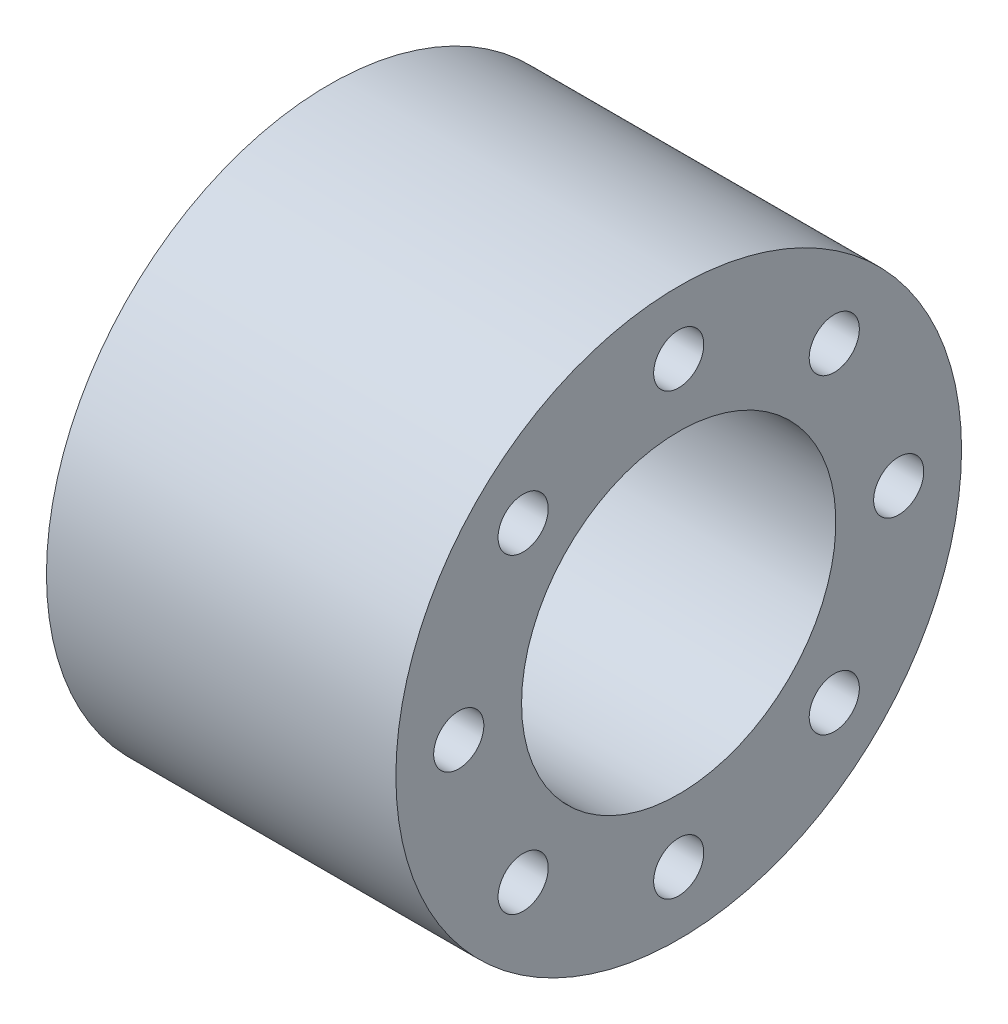
ISO-10303-21;
HEADER;
FILE_DESCRIPTION(('STEP AP214'),'2;1');
FILE_NAME('part.step','',(''),(''),'','','');
FILE_SCHEMA(('AUTOMOTIVE_DESIGN { 1 0 10303 214 1 1 1 1 }'));
ENDSEC;
DATA;
#1=APPLICATION_CONTEXT('core data for automotive mechanical design processes');
#2=APPLICATION_PROTOCOL_DEFINITION('international standard','automotive_design',2000,#1);
#3=PRODUCT_CONTEXT('',#1,'mechanical');
#4=PRODUCT('Part','Part','',(#3));
#5=PRODUCT_RELATED_PRODUCT_CATEGORY('part','',(#4));
#6=PRODUCT_DEFINITION_FORMATION('','',#4);
#7=PRODUCT_DEFINITION_CONTEXT('part definition',#1,'design');
#8=PRODUCT_DEFINITION('design','',#6,#7);
#9=PRODUCT_DEFINITION_SHAPE('','',#8);
#10=(LENGTH_UNIT() NAMED_UNIT(*) SI_UNIT(.MILLI.,.METRE.));
#11=(NAMED_UNIT(*) PLANE_ANGLE_UNIT() SI_UNIT($,.RADIAN.));
#12=(NAMED_UNIT(*) SI_UNIT($,.STERADIAN.) SOLID_ANGLE_UNIT());
#13=UNCERTAINTY_MEASURE_WITH_UNIT(LENGTH_MEASURE(1.E-05),#10,'distance_accuracy_value','');
#14=(GEOMETRIC_REPRESENTATION_CONTEXT(3) GLOBAL_UNCERTAINTY_ASSIGNED_CONTEXT((#13)) GLOBAL_UNIT_ASSIGNED_CONTEXT((#10,
#11,#12)) REPRESENTATION_CONTEXT('',''));
#15=CARTESIAN_POINT('',(0.,0.,0.));
#16=DIRECTION('',(0.,0.,1.));
#17=DIRECTION('',(1.,0.,0.));
#18=AXIS2_PLACEMENT_3D('',#15,#16,#17);
#19=CARTESIAN_POINT('',(0.,38.1,0.));
#20=DIRECTION('',(1.,0.,0.));
#21=DIRECTION('',(0.,0.,-1.));
#22=AXIS2_PLACEMENT_3D('',#19,#20,#21);
#23=PLANE('',#22);
#24=CARTESIAN_POINT('',(0.,27.8665163993717,-11.542689028712));
#25=DIRECTION('',(-1.,0.,0.));
#26=DIRECTION('',(0.,0.,1.));
#27=AXIS2_PLACEMENT_3D('',#24,#25,#26);
#28=CIRCLE('',#27,2.38124999999999);
#29=CARTESIAN_POINT('',(0.,27.8665163993717,-9.16143902871205));
#30=VERTEX_POINT('',#29);
#31=EDGE_CURVE('E84',#30,#30,#28,.T.);
#32=ORIENTED_EDGE('',*,*,#31,.F.);
#33=EDGE_LOOP('',(#32));
#34=FACE_BOUND('',#33,.T.);
#35=CARTESIAN_POINT('',(0.,11.542689028712,27.8665163993717));
#36=DIRECTION('',(-1.,0.,0.));
#37=DIRECTION('',(0.,0.,1.));
#38=AXIS2_PLACEMENT_3D('',#35,#36,#37);
#39=CIRCLE('',#38,2.38124999999999);
#40=CARTESIAN_POINT('',(0.,11.542689028712,30.2477663993717));
#41=VERTEX_POINT('',#40);
#42=EDGE_CURVE('E83',#41,#41,#39,.T.);
#43=ORIENTED_EDGE('',*,*,#42,.F.);
#44=EDGE_LOOP('',(#43));
#45=FACE_BOUND('',#44,.T.);
#46=CARTESIAN_POINT('',(0.,-27.8665163993717,11.542689028712));
#47=DIRECTION('',(-1.,0.,0.));
#48=DIRECTION('',(0.,0.,1.));
#49=AXIS2_PLACEMENT_3D('',#46,#47,#48);
#50=CIRCLE('',#49,2.38124999999999);
#51=CARTESIAN_POINT('',(0.,-27.8665163993717,13.923939028712));
#52=VERTEX_POINT('',#51);
#53=EDGE_CURVE('E97',#52,#52,#50,.T.);
#54=ORIENTED_EDGE('',*,*,#53,.F.);
#55=EDGE_LOOP('',(#54));
#56=FACE_BOUND('',#55,.T.);
#57=CARTESIAN_POINT('',(0.,-11.542689028712,-27.8665163993717));
#58=DIRECTION('',(-1.,0.,0.));
#59=DIRECTION('',(0.,0.,1.));
#60=AXIS2_PLACEMENT_3D('',#57,#58,#59);
#61=CIRCLE('',#60,2.38124999999999);
#62=CARTESIAN_POINT('',(0.,-11.542689028712,-25.4852663993717));
#63=VERTEX_POINT('',#62);
#64=EDGE_CURVE('E105',#63,#63,#61,.T.);
#65=ORIENTED_EDGE('',*,*,#64,.F.);
#66=EDGE_LOOP('',(#65));
#67=FACE_BOUND('',#66,.T.);
#68=CARTESIAN_POINT('',(0.,0.,0.));
#69=DIRECTION('',(-1.,0.,0.));
#70=DIRECTION('',(0.,0.,1.));
#71=AXIS2_PLACEMENT_3D('',#68,#69,#70);
#72=CIRCLE('',#71,21.1666666666667);
#73=CARTESIAN_POINT('',(0.,0.,21.1666666666667));
#74=VERTEX_POINT('',#73);
#75=EDGE_CURVE('E11',#74,#74,#72,.T.);
#76=ORIENTED_EDGE('',*,*,#75,.F.);
#77=EDGE_LOOP('',(#76));
#78=FACE_BOUND('',#77,.T.);
#79=CARTESIAN_POINT('',(0.,0.,0.));
#80=DIRECTION('',(-1.,0.,0.));
#81=DIRECTION('',(0.,0.,1.));
#82=AXIS2_PLACEMENT_3D('',#79,#80,#81);
#83=CIRCLE('',#82,38.1);
#84=CARTESIAN_POINT('',(0.,0.,38.1));
#85=VERTEX_POINT('',#84);
#86=EDGE_CURVE('E241',#85,#85,#83,.T.);
#87=ORIENTED_EDGE('',*,*,#86,.T.);
#88=EDGE_LOOP('',(#87));
#89=FACE_BOUND('',#88,.T.);
#90=CARTESIAN_POINT('',(0.,20.9539309491616,-20.9539309491611));
#91=DIRECTION('',(-1.,0.,0.));
#92=DIRECTION('',(0.,0.,1.));
#93=AXIS2_PLACEMENT_3D('',#90,#91,#92);
#94=CIRCLE('',#93,5.55625);
#95=CARTESIAN_POINT('',(0.,20.9539309491616,-15.3976809491611));
#96=VERTEX_POINT('',#95);
#97=EDGE_CURVE('E225',#96,#96,#94,.T.);
#98=ORIENTED_EDGE('',*,*,#97,.F.);
#99=EDGE_LOOP('',(#98));
#100=FACE_BOUND('',#99,.T.);
#101=CARTESIAN_POINT('',(0.,3.05966363356447E-13,-29.6333333333333));
#102=DIRECTION('',(-1.,0.,0.));
#103=DIRECTION('',(0.,0.,1.));
#104=AXIS2_PLACEMENT_3D('',#101,#102,#103);
#105=CIRCLE('',#104,5.55625);
#106=CARTESIAN_POINT('',(0.,3.05966363356447E-13,-24.0770833333333));
#107=VERTEX_POINT('',#106);
#108=EDGE_CURVE('E209',#107,#107,#105,.T.);
#109=ORIENTED_EDGE('',*,*,#108,.F.);
#110=EDGE_LOOP('',(#109));
#111=FACE_BOUND('',#110,.T.);
#112=CARTESIAN_POINT('',(0.,-20.9539309491612,-20.9539309491615));
#113=DIRECTION('',(-1.,0.,0.));
#114=DIRECTION('',(0.,0.,1.));
#115=AXIS2_PLACEMENT_3D('',#112,#113,#114);
#116=CIRCLE('',#115,5.55625);
#117=CARTESIAN_POINT('',(0.,-20.9539309491612,-15.3976809491615));
#118=VERTEX_POINT('',#117);
#119=EDGE_CURVE('E193',#118,#118,#116,.T.);
#120=ORIENTED_EDGE('',*,*,#119,.F.);
#121=EDGE_LOOP('',(#120));
#122=FACE_BOUND('',#121,.T.);
#123=CARTESIAN_POINT('',(0.,-29.6333333333333,-2.09901540593194E-13));
#124=DIRECTION('',(-1.,0.,0.));
#125=DIRECTION('',(0.,0.,1.));
#126=AXIS2_PLACEMENT_3D('',#123,#124,#125);
#127=CIRCLE('',#126,5.55625);
#128=CARTESIAN_POINT('',(0.,-29.6333333333333,5.55624999999979));
#129=VERTEX_POINT('',#128);
#130=EDGE_CURVE('E177',#129,#129,#127,.T.);
#131=ORIENTED_EDGE('',*,*,#130,.F.);
#132=EDGE_LOOP('',(#131));
#133=FACE_BOUND('',#132,.T.);
#134=CARTESIAN_POINT('',(0.,-20.9539309491618,20.953930949161));
#135=DIRECTION('',(-1.,0.,0.));
#136=DIRECTION('',(0.,0.,1.));
#137=AXIS2_PLACEMENT_3D('',#134,#135,#136);
#138=CIRCLE('',#137,5.55625);
#139=CARTESIAN_POINT('',(0.,-20.9539309491618,26.510180949161));
#140=VERTEX_POINT('',#139);
#141=EDGE_CURVE('E161',#140,#140,#138,.T.);
#142=ORIENTED_EDGE('',*,*,#141,.F.);
#143=EDGE_LOOP('',(#142));
#144=FACE_BOUND('',#143,.T.);
#145=CARTESIAN_POINT('',(0.,-5.27355936696949E-13,29.6333333333333));
#146=DIRECTION('',(-1.,0.,0.));
#147=DIRECTION('',(0.,0.,1.));
#148=AXIS2_PLACEMENT_3D('',#145,#146,#147);
#149=CIRCLE('',#148,5.55625);
#150=CARTESIAN_POINT('',(0.,-5.27355936696949E-13,35.1895833333333));
#151=VERTEX_POINT('',#150);
#152=EDGE_CURVE('E145',#151,#151,#149,.T.);
#153=ORIENTED_EDGE('',*,*,#152,.F.);
#154=EDGE_LOOP('',(#153));
#155=FACE_BOUND('',#154,.T.);
#156=CARTESIAN_POINT('',(0.,20.953930949161,20.9539309491617));
#157=DIRECTION('',(-1.,0.,0.));
#158=DIRECTION('',(0.,0.,1.));
#159=AXIS2_PLACEMENT_3D('',#156,#157,#158);
#160=CIRCLE('',#159,5.55625);
#161=CARTESIAN_POINT('',(0.,20.953930949161,26.5101809491617));
#162=VERTEX_POINT('',#161);
#163=EDGE_CURVE('E129',#162,#162,#160,.T.);
#164=ORIENTED_EDGE('',*,*,#163,.F.);
#165=EDGE_LOOP('',(#164));
#166=FACE_BOUND('',#165,.T.);
#167=CARTESIAN_POINT('',(0.,29.6333333333333,0.));
#168=DIRECTION('',(-1.,0.,0.));
#169=DIRECTION('',(0.,0.,1.));
#170=AXIS2_PLACEMENT_3D('',#167,#168,#169);
#171=CIRCLE('',#170,5.55625);
#172=CARTESIAN_POINT('',(0.,29.6333333333333,5.55625));
#173=VERTEX_POINT('',#172);
#174=EDGE_CURVE('E113',#173,#173,#171,.T.);
#175=ORIENTED_EDGE('',*,*,#174,.F.);
#176=EDGE_LOOP('',(#175));
#177=FACE_BOUND('',#176,.T.);
#178=ADVANCED_FACE('F51',(#34,#45,#56,#67,#78,#89,#100,#111,#122,#133,#144,#155,#166,#177),#23,.F.);
#179=CARTESIAN_POINT('',(0.,0.,0.));
#180=DIRECTION('',(-1.,0.,0.));
#181=DIRECTION('',(0.,0.,1.));
#182=AXIS2_PLACEMENT_3D('',#179,#180,#181);
#183=CYLINDRICAL_SURFACE('',#182,21.1666666666667);
#184=CARTESIAN_POINT('',(47.06874,0.,0.));
#185=DIRECTION('',(-1.,0.,0.));
#186=DIRECTION('',(0.,0.,1.));
#187=AXIS2_PLACEMENT_3D('',#184,#185,#186);
#188=CIRCLE('',#187,21.1666666666667);
#189=CARTESIAN_POINT('',(47.06874,0.,21.1666666666667));
#190=VERTEX_POINT('',#189);
#191=EDGE_CURVE('E59',#190,#190,#188,.T.);
#192=ORIENTED_EDGE('',*,*,#191,.F.);
#193=EDGE_LOOP('',(#192));
#194=FACE_BOUND('',#193,.T.);
#195=ORIENTED_EDGE('',*,*,#75,.T.);
#196=EDGE_LOOP('',(#195));
#197=FACE_BOUND('',#196,.T.);
#198=ADVANCED_FACE('F254',(#194,#197),#183,.F.);
#199=CARTESIAN_POINT('',(47.06874,38.1,0.));
#200=DIRECTION('',(-1.,0.,0.));
#201=DIRECTION('',(0.,0.,1.));
#202=AXIS2_PLACEMENT_3D('',#199,#200,#201);
#203=PLANE('',#202);
#204=CARTESIAN_POINT('',(47.06874,29.6333333333333,0.));
#205=DIRECTION('',(-1.,0.,0.));
#206=DIRECTION('',(0.,0.,1.));
#207=AXIS2_PLACEMENT_3D('',#204,#205,#206);
#208=CIRCLE('',#207,3.37819999999999);
#209=CARTESIAN_POINT('',(47.06874,29.6333333333333,3.37819999999999));
#210=VERTEX_POINT('',#209);
#211=EDGE_CURVE('E125',#210,#210,#208,.T.);
#212=ORIENTED_EDGE('',*,*,#211,.T.);
#213=EDGE_LOOP('',(#212));
#214=FACE_BOUND('',#213,.T.);
#215=CARTESIAN_POINT('',(47.06874,20.953930949161,20.9539309491617));
#216=DIRECTION('',(-1.,0.,0.));
#217=DIRECTION('',(0.,0.,1.));
#218=AXIS2_PLACEMENT_3D('',#215,#216,#217);
#219=CIRCLE('',#218,3.3782);
#220=CARTESIAN_POINT('',(47.06874,20.953930949161,24.3321309491617));
#221=VERTEX_POINT('',#220);
#222=EDGE_CURVE('E141',#221,#221,#219,.T.);
#223=ORIENTED_EDGE('',*,*,#222,.T.);
#224=EDGE_LOOP('',(#223));
#225=FACE_BOUND('',#224,.T.);
#226=CARTESIAN_POINT('',(47.06874,-5.27355936696949E-13,29.6333333333333));
#227=DIRECTION('',(-1.,0.,0.));
#228=DIRECTION('',(0.,0.,1.));
#229=AXIS2_PLACEMENT_3D('',#226,#227,#228);
#230=CIRCLE('',#229,3.3782);
#231=CARTESIAN_POINT('',(47.06874,-5.27355936696949E-13,33.0115333333333));
#232=VERTEX_POINT('',#231);
#233=EDGE_CURVE('E157',#232,#232,#230,.T.);
#234=ORIENTED_EDGE('',*,*,#233,.T.);
#235=EDGE_LOOP('',(#234));
#236=FACE_BOUND('',#235,.T.);
#237=CARTESIAN_POINT('',(47.06874,-20.9539309491618,20.953930949161));
#238=DIRECTION('',(-1.,0.,0.));
#239=DIRECTION('',(0.,0.,1.));
#240=AXIS2_PLACEMENT_3D('',#237,#238,#239);
#241=CIRCLE('',#240,3.3782);
#242=CARTESIAN_POINT('',(47.06874,-20.9539309491618,24.332130949161));
#243=VERTEX_POINT('',#242);
#244=EDGE_CURVE('E173',#243,#243,#241,.T.);
#245=ORIENTED_EDGE('',*,*,#244,.T.);
#246=EDGE_LOOP('',(#245));
#247=FACE_BOUND('',#246,.T.);
#248=CARTESIAN_POINT('',(47.06874,-29.6333333333333,-2.09901540593194E-13));
#249=DIRECTION('',(-1.,0.,0.));
#250=DIRECTION('',(0.,0.,1.));
#251=AXIS2_PLACEMENT_3D('',#248,#249,#250);
#252=CIRCLE('',#251,3.3782);
#253=CARTESIAN_POINT('',(47.06874,-29.6333333333333,3.37819999999979));
#254=VERTEX_POINT('',#253);
#255=EDGE_CURVE('E189',#254,#254,#252,.T.);
#256=ORIENTED_EDGE('',*,*,#255,.T.);
#257=EDGE_LOOP('',(#256));
#258=FACE_BOUND('',#257,.T.);
#259=CARTESIAN_POINT('',(47.06874,-20.9539309491612,-20.9539309491615));
#260=DIRECTION('',(-1.,0.,0.));
#261=DIRECTION('',(0.,0.,1.));
#262=AXIS2_PLACEMENT_3D('',#259,#260,#261);
#263=CIRCLE('',#262,3.3782);
#264=CARTESIAN_POINT('',(47.06874,-20.9539309491612,-17.5757309491615));
#265=VERTEX_POINT('',#264);
#266=EDGE_CURVE('E205',#265,#265,#263,.T.);
#267=ORIENTED_EDGE('',*,*,#266,.T.);
#268=EDGE_LOOP('',(#267));
#269=FACE_BOUND('',#268,.T.);
#270=CARTESIAN_POINT('',(47.06874,3.05966363356447E-13,-29.6333333333333));
#271=DIRECTION('',(-1.,0.,0.));
#272=DIRECTION('',(0.,0.,1.));
#273=AXIS2_PLACEMENT_3D('',#270,#271,#272);
#274=CIRCLE('',#273,3.3782);
#275=CARTESIAN_POINT('',(47.06874,3.05966363356447E-13,-26.2551333333333));
#276=VERTEX_POINT('',#275);
#277=EDGE_CURVE('E221',#276,#276,#274,.T.);
#278=ORIENTED_EDGE('',*,*,#277,.T.);
#279=EDGE_LOOP('',(#278));
#280=FACE_BOUND('',#279,.T.);
#281=CARTESIAN_POINT('',(47.06874,20.9539309491616,-20.9539309491611));
#282=DIRECTION('',(-1.,0.,0.));
#283=DIRECTION('',(0.,0.,1.));
#284=AXIS2_PLACEMENT_3D('',#281,#282,#283);
#285=CIRCLE('',#284,3.3782);
#286=CARTESIAN_POINT('',(47.06874,20.9539309491616,-17.5757309491611));
#287=VERTEX_POINT('',#286);
#288=EDGE_CURVE('E237',#287,#287,#285,.T.);
#289=ORIENTED_EDGE('',*,*,#288,.T.);
#290=EDGE_LOOP('',(#289));
#291=FACE_BOUND('',#290,.T.);
#292=CARTESIAN_POINT('',(47.06874,0.,0.));
#293=DIRECTION('',(-1.,0.,0.));
#294=DIRECTION('',(0.,0.,1.));
#295=AXIS2_PLACEMENT_3D('',#292,#293,#294);
#296=CIRCLE('',#295,38.1);
#297=CARTESIAN_POINT('',(47.06874,0.,38.1));
#298=VERTEX_POINT('',#297);
#299=EDGE_CURVE('E245',#298,#298,#296,.T.);
#300=ORIENTED_EDGE('',*,*,#299,.F.);
#301=EDGE_LOOP('',(#300));
#302=FACE_BOUND('',#301,.T.);
#303=ORIENTED_EDGE('',*,*,#191,.T.);
#304=EDGE_LOOP('',(#303));
#305=FACE_BOUND('',#304,.T.);
#306=ADVANCED_FACE('F252',(#214,#225,#236,#247,#258,#269,#280,#291,#302,#305),#203,.F.);
#307=CARTESIAN_POINT('',(0.,0.,0.));
#308=DIRECTION('',(-1.,0.,0.));
#309=DIRECTION('',(0.,0.,1.));
#310=AXIS2_PLACEMENT_3D('',#307,#308,#309);
#311=CYLINDRICAL_SURFACE('',#310,38.1);
#312=ORIENTED_EDGE('',*,*,#86,.F.);
#313=EDGE_LOOP('',(#312));
#314=FACE_BOUND('',#313,.T.);
#315=ORIENTED_EDGE('',*,*,#299,.T.);
#316=EDGE_LOOP('',(#315));
#317=FACE_BOUND('',#316,.T.);
#318=ADVANCED_FACE('F384',(#314,#317),#311,.T.);
#319=CARTESIAN_POINT('',(0.,20.9539309491616,-20.9539309491611));
#320=DIRECTION('',(-1.,0.,0.));
#321=DIRECTION('',(0.,0.,1.));
#322=AXIS2_PLACEMENT_3D('',#319,#320,#321);
#323=CYLINDRICAL_SURFACE('',#322,3.3782);
#324=ORIENTED_EDGE('',*,*,#288,.F.);
#325=EDGE_LOOP('',(#324));
#326=FACE_BOUND('',#325,.T.);
#327=CARTESIAN_POINT('',(6.35,20.9539309491616,-20.9539309491611));
#328=DIRECTION('',(-1.,0.,0.));
#329=DIRECTION('',(0.,0.,1.));
#330=AXIS2_PLACEMENT_3D('',#327,#328,#329);
#331=CIRCLE('',#330,3.3782);
#332=CARTESIAN_POINT('',(6.35,20.9539309491616,-17.5757309491611));
#333=VERTEX_POINT('',#332);
#334=EDGE_CURVE('E233',#333,#333,#331,.T.);
#335=ORIENTED_EDGE('',*,*,#334,.T.);
#336=EDGE_LOOP('',(#335));
#337=FACE_BOUND('',#336,.T.);
#338=ADVANCED_FACE('F380',(#326,#337),#323,.F.);
#339=CARTESIAN_POINT('',(6.35,24.3321309491616,-20.9539309491611));
#340=DIRECTION('',(1.,0.,0.));
#341=DIRECTION('',(0.,0.,-1.));
#342=AXIS2_PLACEMENT_3D('',#339,#340,#341);
#343=PLANE('',#342);
#344=ORIENTED_EDGE('',*,*,#334,.F.);
#345=EDGE_LOOP('',(#344));
#346=FACE_BOUND('',#345,.T.);
#347=CARTESIAN_POINT('',(6.35,20.9539309491616,-20.9539309491611));
#348=DIRECTION('',(-1.,0.,0.));
#349=DIRECTION('',(0.,0.,1.));
#350=AXIS2_PLACEMENT_3D('',#347,#348,#349);
#351=CIRCLE('',#350,5.55625);
#352=CARTESIAN_POINT('',(6.35,20.9539309491616,-15.3976809491611));
#353=VERTEX_POINT('',#352);
#354=EDGE_CURVE('E229',#353,#353,#351,.T.);
#355=ORIENTED_EDGE('',*,*,#354,.T.);
#356=EDGE_LOOP('',(#355));
#357=FACE_BOUND('',#356,.T.);
#358=ADVANCED_FACE('F376',(#346,#357),#343,.F.);
#359=CARTESIAN_POINT('',(0.,20.9539309491616,-20.9539309491611));
#360=DIRECTION('',(-1.,0.,0.));
#361=DIRECTION('',(0.,0.,1.));
#362=AXIS2_PLACEMENT_3D('',#359,#360,#361);
#363=CYLINDRICAL_SURFACE('',#362,5.55625);
#364=ORIENTED_EDGE('',*,*,#354,.F.);
#365=EDGE_LOOP('',(#364));
#366=FACE_BOUND('',#365,.T.);
#367=ORIENTED_EDGE('',*,*,#97,.T.);
#368=EDGE_LOOP('',(#367));
#369=FACE_BOUND('',#368,.T.);
#370=ADVANCED_FACE('F372',(#366,#369),#363,.F.);
#371=CARTESIAN_POINT('',(0.,3.05966363356447E-13,-29.6333333333333));
#372=DIRECTION('',(-1.,0.,0.));
#373=DIRECTION('',(0.,0.,1.));
#374=AXIS2_PLACEMENT_3D('',#371,#372,#373);
#375=CYLINDRICAL_SURFACE('',#374,3.3782);
#376=ORIENTED_EDGE('',*,*,#277,.F.);
#377=EDGE_LOOP('',(#376));
#378=FACE_BOUND('',#377,.T.);
#379=CARTESIAN_POINT('',(6.35,3.05966363356447E-13,-29.6333333333333));
#380=DIRECTION('',(-1.,0.,0.));
#381=DIRECTION('',(0.,0.,1.));
#382=AXIS2_PLACEMENT_3D('',#379,#380,#381);
#383=CIRCLE('',#382,3.3782);
#384=CARTESIAN_POINT('',(6.35,3.05966363356447E-13,-26.2551333333333));
#385=VERTEX_POINT('',#384);
#386=EDGE_CURVE('E217',#385,#385,#383,.T.);
#387=ORIENTED_EDGE('',*,*,#386,.T.);
#388=EDGE_LOOP('',(#387));
#389=FACE_BOUND('',#388,.T.);
#390=ADVANCED_FACE('F368',(#378,#389),#375,.F.);
#391=CARTESIAN_POINT('',(6.35,3.37820000000031,-29.6333333333333));
#392=DIRECTION('',(1.,0.,0.));
#393=DIRECTION('',(0.,0.,-1.));
#394=AXIS2_PLACEMENT_3D('',#391,#392,#393);
#395=PLANE('',#394);
#396=ORIENTED_EDGE('',*,*,#386,.F.);
#397=EDGE_LOOP('',(#396));
#398=FACE_BOUND('',#397,.T.);
#399=CARTESIAN_POINT('',(6.35,3.05966363356447E-13,-29.6333333333333));
#400=DIRECTION('',(-1.,0.,0.));
#401=DIRECTION('',(0.,0.,1.));
#402=AXIS2_PLACEMENT_3D('',#399,#400,#401);
#403=CIRCLE('',#402,5.55625);
#404=CARTESIAN_POINT('',(6.35,3.05966363356447E-13,-24.0770833333333));
#405=VERTEX_POINT('',#404);
#406=EDGE_CURVE('E213',#405,#405,#403,.T.);
#407=ORIENTED_EDGE('',*,*,#406,.T.);
#408=EDGE_LOOP('',(#407));
#409=FACE_BOUND('',#408,.T.);
#410=ADVANCED_FACE('F364',(#398,#409),#395,.F.);
#411=CARTESIAN_POINT('',(0.,3.05966363356447E-13,-29.6333333333333));
#412=DIRECTION('',(-1.,0.,0.));
#413=DIRECTION('',(0.,0.,1.));
#414=AXIS2_PLACEMENT_3D('',#411,#412,#413);
#415=CYLINDRICAL_SURFACE('',#414,5.55625);
#416=ORIENTED_EDGE('',*,*,#406,.F.);
#417=EDGE_LOOP('',(#416));
#418=FACE_BOUND('',#417,.T.);
#419=ORIENTED_EDGE('',*,*,#108,.T.);
#420=EDGE_LOOP('',(#419));
#421=FACE_BOUND('',#420,.T.);
#422=ADVANCED_FACE('F360',(#418,#421),#415,.F.);
#423=CARTESIAN_POINT('',(0.,-20.9539309491612,-20.9539309491615));
#424=DIRECTION('',(-1.,0.,0.));
#425=DIRECTION('',(0.,0.,1.));
#426=AXIS2_PLACEMENT_3D('',#423,#424,#425);
#427=CYLINDRICAL_SURFACE('',#426,3.3782);
#428=ORIENTED_EDGE('',*,*,#266,.F.);
#429=EDGE_LOOP('',(#428));
#430=FACE_BOUND('',#429,.T.);
#431=CARTESIAN_POINT('',(6.35,-20.9539309491612,-20.9539309491615));
#432=DIRECTION('',(-1.,0.,0.));
#433=DIRECTION('',(0.,0.,1.));
#434=AXIS2_PLACEMENT_3D('',#431,#432,#433);
#435=CIRCLE('',#434,3.3782);
#436=CARTESIAN_POINT('',(6.35,-20.9539309491612,-17.5757309491615));
#437=VERTEX_POINT('',#436);
#438=EDGE_CURVE('E201',#437,#437,#435,.T.);
#439=ORIENTED_EDGE('',*,*,#438,.T.);
#440=EDGE_LOOP('',(#439));
#441=FACE_BOUND('',#440,.T.);
#442=ADVANCED_FACE('F356',(#430,#441),#427,.F.);
#443=CARTESIAN_POINT('',(6.35,-17.5757309491612,-20.9539309491615));
#444=DIRECTION('',(1.,0.,0.));
#445=DIRECTION('',(0.,0.,-1.));
#446=AXIS2_PLACEMENT_3D('',#443,#444,#445);
#447=PLANE('',#446);
#448=ORIENTED_EDGE('',*,*,#438,.F.);
#449=EDGE_LOOP('',(#448));
#450=FACE_BOUND('',#449,.T.);
#451=CARTESIAN_POINT('',(6.35,-20.9539309491612,-20.9539309491615));
#452=DIRECTION('',(-1.,0.,0.));
#453=DIRECTION('',(0.,0.,1.));
#454=AXIS2_PLACEMENT_3D('',#451,#452,#453);
#455=CIRCLE('',#454,5.55625);
#456=CARTESIAN_POINT('',(6.35,-20.9539309491612,-15.3976809491615));
#457=VERTEX_POINT('',#456);
#458=EDGE_CURVE('E197',#457,#457,#455,.T.);
#459=ORIENTED_EDGE('',*,*,#458,.T.);
#460=EDGE_LOOP('',(#459));
#461=FACE_BOUND('',#460,.T.);
#462=ADVANCED_FACE('F352',(#450,#461),#447,.F.);
#463=CARTESIAN_POINT('',(0.,-20.9539309491612,-20.9539309491615));
#464=DIRECTION('',(-1.,0.,0.));
#465=DIRECTION('',(0.,0.,1.));
#466=AXIS2_PLACEMENT_3D('',#463,#464,#465);
#467=CYLINDRICAL_SURFACE('',#466,5.55625);
#468=ORIENTED_EDGE('',*,*,#458,.F.);
#469=EDGE_LOOP('',(#468));
#470=FACE_BOUND('',#469,.T.);
#471=ORIENTED_EDGE('',*,*,#119,.T.);
#472=EDGE_LOOP('',(#471));
#473=FACE_BOUND('',#472,.T.);
#474=ADVANCED_FACE('F348',(#470,#473),#467,.F.);
#475=CARTESIAN_POINT('',(0.,-29.6333333333333,-2.09901540593194E-13));
#476=DIRECTION('',(-1.,0.,0.));
#477=DIRECTION('',(0.,0.,1.));
#478=AXIS2_PLACEMENT_3D('',#475,#476,#477);
#479=CYLINDRICAL_SURFACE('',#478,3.3782);
#480=ORIENTED_EDGE('',*,*,#255,.F.);
#481=EDGE_LOOP('',(#480));
#482=FACE_BOUND('',#481,.T.);
#483=CARTESIAN_POINT('',(6.35,-29.6333333333333,-2.09901540593194E-13));
#484=DIRECTION('',(-1.,0.,0.));
#485=DIRECTION('',(0.,0.,1.));
#486=AXIS2_PLACEMENT_3D('',#483,#484,#485);
#487=CIRCLE('',#486,3.3782);
#488=CARTESIAN_POINT('',(6.35,-29.6333333333333,3.37819999999979));
#489=VERTEX_POINT('',#488);
#490=EDGE_CURVE('E185',#489,#489,#487,.T.);
#491=ORIENTED_EDGE('',*,*,#490,.T.);
#492=EDGE_LOOP('',(#491));
#493=FACE_BOUND('',#492,.T.);
#494=ADVANCED_FACE('F344',(#482,#493),#479,.F.);
#495=CARTESIAN_POINT('',(6.35,-26.2551333333333,-2.09901540593194E-13));
#496=DIRECTION('',(1.,0.,0.));
#497=DIRECTION('',(0.,0.,-1.));
#498=AXIS2_PLACEMENT_3D('',#495,#496,#497);
#499=PLANE('',#498);
#500=ORIENTED_EDGE('',*,*,#490,.F.);
#501=EDGE_LOOP('',(#500));
#502=FACE_BOUND('',#501,.T.);
#503=CARTESIAN_POINT('',(6.35,-29.6333333333333,-2.09901540593194E-13));
#504=DIRECTION('',(-1.,0.,0.));
#505=DIRECTION('',(0.,0.,1.));
#506=AXIS2_PLACEMENT_3D('',#503,#504,#505);
#507=CIRCLE('',#506,5.55625);
#508=CARTESIAN_POINT('',(6.35,-29.6333333333333,5.55624999999979));
#509=VERTEX_POINT('',#508);
#510=EDGE_CURVE('E181',#509,#509,#507,.T.);
#511=ORIENTED_EDGE('',*,*,#510,.T.);
#512=EDGE_LOOP('',(#511));
#513=FACE_BOUND('',#512,.T.);
#514=ADVANCED_FACE('F340',(#502,#513),#499,.F.);
#515=CARTESIAN_POINT('',(0.,-29.6333333333333,-2.09901540593194E-13));
#516=DIRECTION('',(-1.,0.,0.));
#517=DIRECTION('',(0.,0.,1.));
#518=AXIS2_PLACEMENT_3D('',#515,#516,#517);
#519=CYLINDRICAL_SURFACE('',#518,5.55625);
#520=ORIENTED_EDGE('',*,*,#510,.F.);
#521=EDGE_LOOP('',(#520));
#522=FACE_BOUND('',#521,.T.);
#523=ORIENTED_EDGE('',*,*,#130,.T.);
#524=EDGE_LOOP('',(#523));
#525=FACE_BOUND('',#524,.T.);
#526=ADVANCED_FACE('F336',(#522,#525),#519,.F.);
#527=CARTESIAN_POINT('',(0.,-20.9539309491618,20.953930949161));
#528=DIRECTION('',(-1.,0.,0.));
#529=DIRECTION('',(0.,0.,1.));
#530=AXIS2_PLACEMENT_3D('',#527,#528,#529);
#531=CYLINDRICAL_SURFACE('',#530,3.3782);
#532=ORIENTED_EDGE('',*,*,#244,.F.);
#533=EDGE_LOOP('',(#532));
#534=FACE_BOUND('',#533,.T.);
#535=CARTESIAN_POINT('',(6.35,-20.9539309491618,20.953930949161));
#536=DIRECTION('',(-1.,0.,0.));
#537=DIRECTION('',(0.,0.,1.));
#538=AXIS2_PLACEMENT_3D('',#535,#536,#537);
#539=CIRCLE('',#538,3.3782);
#540=CARTESIAN_POINT('',(6.35,-20.9539309491618,24.332130949161));
#541=VERTEX_POINT('',#540);
#542=EDGE_CURVE('E169',#541,#541,#539,.T.);
#543=ORIENTED_EDGE('',*,*,#542,.T.);
#544=EDGE_LOOP('',(#543));
#545=FACE_BOUND('',#544,.T.);
#546=ADVANCED_FACE('F332',(#534,#545),#531,.F.);
#547=CARTESIAN_POINT('',(6.35,-17.5757309491618,20.953930949161));
#548=DIRECTION('',(1.,0.,0.));
#549=DIRECTION('',(0.,0.,-1.));
#550=AXIS2_PLACEMENT_3D('',#547,#548,#549);
#551=PLANE('',#550);
#552=ORIENTED_EDGE('',*,*,#542,.F.);
#553=EDGE_LOOP('',(#552));
#554=FACE_BOUND('',#553,.T.);
#555=CARTESIAN_POINT('',(6.35,-20.9539309491618,20.953930949161));
#556=DIRECTION('',(-1.,0.,0.));
#557=DIRECTION('',(0.,0.,1.));
#558=AXIS2_PLACEMENT_3D('',#555,#556,#557);
#559=CIRCLE('',#558,5.55625);
#560=CARTESIAN_POINT('',(6.35,-20.9539309491618,26.510180949161));
#561=VERTEX_POINT('',#560);
#562=EDGE_CURVE('E165',#561,#561,#559,.T.);
#563=ORIENTED_EDGE('',*,*,#562,.T.);
#564=EDGE_LOOP('',(#563));
#565=FACE_BOUND('',#564,.T.);
#566=ADVANCED_FACE('F328',(#554,#565),#551,.F.);
#567=CARTESIAN_POINT('',(0.,-20.9539309491618,20.953930949161));
#568=DIRECTION('',(-1.,0.,0.));
#569=DIRECTION('',(0.,0.,1.));
#570=AXIS2_PLACEMENT_3D('',#567,#568,#569);
#571=CYLINDRICAL_SURFACE('',#570,5.55625);
#572=ORIENTED_EDGE('',*,*,#562,.F.);
#573=EDGE_LOOP('',(#572));
#574=FACE_BOUND('',#573,.T.);
#575=ORIENTED_EDGE('',*,*,#141,.T.);
#576=EDGE_LOOP('',(#575));
#577=FACE_BOUND('',#576,.T.);
#578=ADVANCED_FACE('F324',(#574,#577),#571,.F.);
#579=CARTESIAN_POINT('',(0.,-5.27355936696949E-13,29.6333333333333));
#580=DIRECTION('',(-1.,0.,0.));
#581=DIRECTION('',(0.,0.,1.));
#582=AXIS2_PLACEMENT_3D('',#579,#580,#581);
#583=CYLINDRICAL_SURFACE('',#582,3.3782);
#584=ORIENTED_EDGE('',*,*,#233,.F.);
#585=EDGE_LOOP('',(#584));
#586=FACE_BOUND('',#585,.T.);
#587=CARTESIAN_POINT('',(6.35,-5.27355936696949E-13,29.6333333333333));
#588=DIRECTION('',(-1.,0.,0.));
#589=DIRECTION('',(0.,0.,1.));
#590=AXIS2_PLACEMENT_3D('',#587,#588,#589);
#591=CIRCLE('',#590,3.3782);
#592=CARTESIAN_POINT('',(6.35,-5.27355936696949E-13,33.0115333333333));
#593=VERTEX_POINT('',#592);
#594=EDGE_CURVE('E153',#593,#593,#591,.T.);
#595=ORIENTED_EDGE('',*,*,#594,.T.);
#596=EDGE_LOOP('',(#595));
#597=FACE_BOUND('',#596,.T.);
#598=ADVANCED_FACE('F320',(#586,#597),#583,.F.);
#599=CARTESIAN_POINT('',(6.35,3.37819999999948,29.6333333333333));
#600=DIRECTION('',(1.,0.,0.));
#601=DIRECTION('',(0.,0.,-1.));
#602=AXIS2_PLACEMENT_3D('',#599,#600,#601);
#603=PLANE('',#602);
#604=ORIENTED_EDGE('',*,*,#594,.F.);
#605=EDGE_LOOP('',(#604));
#606=FACE_BOUND('',#605,.T.);
#607=CARTESIAN_POINT('',(6.35,-5.27355936696949E-13,29.6333333333333));
#608=DIRECTION('',(-1.,0.,0.));
#609=DIRECTION('',(0.,0.,1.));
#610=AXIS2_PLACEMENT_3D('',#607,#608,#609);
#611=CIRCLE('',#610,5.55625);
#612=CARTESIAN_POINT('',(6.35,-5.27355936696949E-13,35.1895833333333));
#613=VERTEX_POINT('',#612);
#614=EDGE_CURVE('E149',#613,#613,#611,.T.);
#615=ORIENTED_EDGE('',*,*,#614,.T.);
#616=EDGE_LOOP('',(#615));
#617=FACE_BOUND('',#616,.T.);
#618=ADVANCED_FACE('F316',(#606,#617),#603,.F.);
#619=CARTESIAN_POINT('',(0.,-5.27355936696949E-13,29.6333333333333));
#620=DIRECTION('',(-1.,0.,0.));
#621=DIRECTION('',(0.,0.,1.));
#622=AXIS2_PLACEMENT_3D('',#619,#620,#621);
#623=CYLINDRICAL_SURFACE('',#622,5.55625);
#624=ORIENTED_EDGE('',*,*,#614,.F.);
#625=EDGE_LOOP('',(#624));
#626=FACE_BOUND('',#625,.T.);
#627=ORIENTED_EDGE('',*,*,#152,.T.);
#628=EDGE_LOOP('',(#627));
#629=FACE_BOUND('',#628,.T.);
#630=ADVANCED_FACE('F312',(#626,#629),#623,.F.);
#631=CARTESIAN_POINT('',(0.,20.953930949161,20.9539309491617));
#632=DIRECTION('',(-1.,0.,0.));
#633=DIRECTION('',(0.,0.,1.));
#634=AXIS2_PLACEMENT_3D('',#631,#632,#633);
#635=CYLINDRICAL_SURFACE('',#634,3.3782);
#636=ORIENTED_EDGE('',*,*,#222,.F.);
#637=EDGE_LOOP('',(#636));
#638=FACE_BOUND('',#637,.T.);
#639=CARTESIAN_POINT('',(6.35,20.953930949161,20.9539309491617));
#640=DIRECTION('',(-1.,0.,0.));
#641=DIRECTION('',(0.,0.,1.));
#642=AXIS2_PLACEMENT_3D('',#639,#640,#641);
#643=CIRCLE('',#642,3.3782);
#644=CARTESIAN_POINT('',(6.35,20.953930949161,24.3321309491617));
#645=VERTEX_POINT('',#644);
#646=EDGE_CURVE('E137',#645,#645,#643,.T.);
#647=ORIENTED_EDGE('',*,*,#646,.T.);
#648=EDGE_LOOP('',(#647));
#649=FACE_BOUND('',#648,.T.);
#650=ADVANCED_FACE('F308',(#638,#649),#635,.F.);
#651=CARTESIAN_POINT('',(6.35,24.332130949161,20.9539309491617));
#652=DIRECTION('',(1.,0.,0.));
#653=DIRECTION('',(0.,0.,-1.));
#654=AXIS2_PLACEMENT_3D('',#651,#652,#653);
#655=PLANE('',#654);
#656=ORIENTED_EDGE('',*,*,#646,.F.);
#657=EDGE_LOOP('',(#656));
#658=FACE_BOUND('',#657,.T.);
#659=CARTESIAN_POINT('',(6.35,20.953930949161,20.9539309491617));
#660=DIRECTION('',(-1.,0.,0.));
#661=DIRECTION('',(0.,0.,1.));
#662=AXIS2_PLACEMENT_3D('',#659,#660,#661);
#663=CIRCLE('',#662,5.55625);
#664=CARTESIAN_POINT('',(6.35,20.953930949161,26.5101809491617));
#665=VERTEX_POINT('',#664);
#666=EDGE_CURVE('E133',#665,#665,#663,.T.);
#667=ORIENTED_EDGE('',*,*,#666,.T.);
#668=EDGE_LOOP('',(#667));
#669=FACE_BOUND('',#668,.T.);
#670=ADVANCED_FACE('F304',(#658,#669),#655,.F.);
#671=CARTESIAN_POINT('',(0.,20.953930949161,20.9539309491617));
#672=DIRECTION('',(-1.,0.,0.));
#673=DIRECTION('',(0.,0.,1.));
#674=AXIS2_PLACEMENT_3D('',#671,#672,#673);
#675=CYLINDRICAL_SURFACE('',#674,5.55625);
#676=ORIENTED_EDGE('',*,*,#666,.F.);
#677=EDGE_LOOP('',(#676));
#678=FACE_BOUND('',#677,.T.);
#679=ORIENTED_EDGE('',*,*,#163,.T.);
#680=EDGE_LOOP('',(#679));
#681=FACE_BOUND('',#680,.T.);
#682=ADVANCED_FACE('F301',(#678,#681),#675,.F.);
#683=CARTESIAN_POINT('',(0.,29.6333333333333,0.));
#684=DIRECTION('',(-1.,0.,0.));
#685=DIRECTION('',(0.,0.,1.));
#686=AXIS2_PLACEMENT_3D('',#683,#684,#685);
#687=CYLINDRICAL_SURFACE('',#686,3.37819999999999);
#688=ORIENTED_EDGE('',*,*,#211,.F.);
#689=EDGE_LOOP('',(#688));
#690=FACE_BOUND('',#689,.T.);
#691=CARTESIAN_POINT('',(6.35,29.6333333333333,0.));
#692=DIRECTION('',(-1.,0.,0.));
#693=DIRECTION('',(0.,0.,1.));
#694=AXIS2_PLACEMENT_3D('',#691,#692,#693);
#695=CIRCLE('',#694,3.3782);
#696=CARTESIAN_POINT('',(6.35,29.6333333333333,3.3782));
#697=VERTEX_POINT('',#696);
#698=EDGE_CURVE('E121',#697,#697,#695,.T.);
#699=ORIENTED_EDGE('',*,*,#698,.T.);
#700=EDGE_LOOP('',(#699));
#701=FACE_BOUND('',#700,.T.);
#702=ADVANCED_FACE('F293',(#690,#701),#687,.F.);
#703=CARTESIAN_POINT('',(6.35,33.0115333333333,0.));
#704=DIRECTION('',(1.,0.,0.));
#705=DIRECTION('',(0.,0.,-1.));
#706=AXIS2_PLACEMENT_3D('',#703,#704,#705);
#707=PLANE('',#706);
#708=ORIENTED_EDGE('',*,*,#698,.F.);
#709=EDGE_LOOP('',(#708));
#710=FACE_BOUND('',#709,.T.);
#711=CARTESIAN_POINT('',(6.35,29.6333333333333,0.));
#712=DIRECTION('',(-1.,0.,0.));
#713=DIRECTION('',(0.,0.,1.));
#714=AXIS2_PLACEMENT_3D('',#711,#712,#713);
#715=CIRCLE('',#714,5.55625);
#716=CARTESIAN_POINT('',(6.35,29.6333333333333,5.55625));
#717=VERTEX_POINT('',#716);
#718=EDGE_CURVE('E117',#717,#717,#715,.T.);
#719=ORIENTED_EDGE('',*,*,#718,.T.);
#720=EDGE_LOOP('',(#719));
#721=FACE_BOUND('',#720,.T.);
#722=ADVANCED_FACE('F283',(#710,#721),#707,.F.);
#723=CARTESIAN_POINT('',(0.,29.6333333333333,0.));
#724=DIRECTION('',(-1.,0.,0.));
#725=DIRECTION('',(0.,0.,1.));
#726=AXIS2_PLACEMENT_3D('',#723,#724,#725);
#727=CYLINDRICAL_SURFACE('',#726,5.55625);
#728=ORIENTED_EDGE('',*,*,#718,.F.);
#729=EDGE_LOOP('',(#728));
#730=FACE_BOUND('',#729,.T.);
#731=ORIENTED_EDGE('',*,*,#174,.T.);
#732=EDGE_LOOP('',(#731));
#733=FACE_BOUND('',#732,.T.);
#734=ADVANCED_FACE('F280',(#730,#733),#727,.F.);
#735=CARTESIAN_POINT('',(9.652,-11.542689028712,-27.8665163993717));
#736=DIRECTION('',(-1.,0.,0.));
#737=DIRECTION('',(0.,0.,1.));
#738=AXIS2_PLACEMENT_3D('',#735,#736,#737);
#739=CONICAL_SURFACE('',#738,2.38125,1.02974425867665);
#740=CARTESIAN_POINT('',(11.0827993490594,-11.542689028712,-27.8665163993717));
#741=VERTEX_POINT('',#740);
#742=VERTEX_LOOP('',#741);
#743=FACE_BOUND('',#742,.T.);
#744=CARTESIAN_POINT('',(9.652,-11.542689028712,-27.8665163993717));
#745=DIRECTION('',(-1.,0.,0.));
#746=DIRECTION('',(0.,0.,1.));
#747=AXIS2_PLACEMENT_3D('',#744,#745,#746);
#748=CIRCLE('',#747,2.38125);
#749=CARTESIAN_POINT('',(9.652,-11.542689028712,-25.4852663993717));
#750=VERTEX_POINT('',#749);
#751=EDGE_CURVE('E109',#750,#750,#748,.T.);
#752=ORIENTED_EDGE('',*,*,#751,.T.);
#753=EDGE_LOOP('',(#752));
#754=FACE_BOUND('',#753,.T.);
#755=ADVANCED_FACE('F282',(#743,#754),#739,.F.);
#756=CARTESIAN_POINT('',(0.,-11.542689028712,-27.8665163993717));
#757=DIRECTION('',(-1.,0.,0.));
#758=DIRECTION('',(0.,0.,1.));
#759=AXIS2_PLACEMENT_3D('',#756,#757,#758);
#760=CYLINDRICAL_SURFACE('',#759,2.38124999999999);
#761=ORIENTED_EDGE('',*,*,#751,.F.);
#762=EDGE_LOOP('',(#761));
#763=FACE_BOUND('',#762,.T.);
#764=ORIENTED_EDGE('',*,*,#64,.T.);
#765=EDGE_LOOP('',(#764));
#766=FACE_BOUND('',#765,.T.);
#767=ADVANCED_FACE('F290',(#763,#766),#760,.F.);
#768=CARTESIAN_POINT('',(9.652,-27.8665163993717,11.542689028712));
#769=DIRECTION('',(-1.,0.,0.));
#770=DIRECTION('',(0.,0.,1.));
#771=AXIS2_PLACEMENT_3D('',#768,#769,#770);
#772=CONICAL_SURFACE('',#771,2.38125,1.02974425867665);
#773=CARTESIAN_POINT('',(11.0827993490594,-27.8665163993717,11.542689028712));
#774=VERTEX_POINT('',#773);
#775=VERTEX_LOOP('',#774);
#776=FACE_BOUND('',#775,.T.);
#777=CARTESIAN_POINT('',(9.652,-27.8665163993717,11.542689028712));
#778=DIRECTION('',(-1.,0.,0.));
#779=DIRECTION('',(0.,0.,1.));
#780=AXIS2_PLACEMENT_3D('',#777,#778,#779);
#781=CIRCLE('',#780,2.38125);
#782=CARTESIAN_POINT('',(9.652,-27.8665163993717,13.923939028712));
#783=VERTEX_POINT('',#782);
#784=EDGE_CURVE('E101',#783,#783,#781,.T.);
#785=ORIENTED_EDGE('',*,*,#784,.T.);
#786=EDGE_LOOP('',(#785));
#787=FACE_BOUND('',#786,.T.);
#788=ADVANCED_FACE('F612',(#776,#787),#772,.F.);
#789=CARTESIAN_POINT('',(0.,-27.8665163993717,11.542689028712));
#790=DIRECTION('',(-1.,0.,0.));
#791=DIRECTION('',(0.,0.,1.));
#792=AXIS2_PLACEMENT_3D('',#789,#790,#791);
#793=CYLINDRICAL_SURFACE('',#792,2.38124999999999);
#794=ORIENTED_EDGE('',*,*,#784,.F.);
#795=EDGE_LOOP('',(#794));
#796=FACE_BOUND('',#795,.T.);
#797=ORIENTED_EDGE('',*,*,#53,.T.);
#798=EDGE_LOOP('',(#797));
#799=FACE_BOUND('',#798,.T.);
#800=ADVANCED_FACE('F620',(#796,#799),#793,.F.);
#801=CARTESIAN_POINT('',(9.652,11.542689028712,27.8665163993717));
#802=DIRECTION('',(-1.,0.,0.));
#803=DIRECTION('',(0.,0.,1.));
#804=AXIS2_PLACEMENT_3D('',#801,#802,#803);
#805=CONICAL_SURFACE('',#804,2.38125,1.02974425867665);
#806=CARTESIAN_POINT('',(11.0827993490594,11.542689028712,27.8665163993717));
#807=VERTEX_POINT('',#806);
#808=VERTEX_LOOP('',#807);
#809=FACE_BOUND('',#808,.T.);
#810=CARTESIAN_POINT('',(9.652,11.542689028712,27.8665163993717));
#811=DIRECTION('',(-1.,0.,0.));
#812=DIRECTION('',(0.,0.,1.));
#813=AXIS2_PLACEMENT_3D('',#810,#811,#812);
#814=CIRCLE('',#813,2.38125);
#815=CARTESIAN_POINT('',(9.652,11.542689028712,30.2477663993717));
#816=VERTEX_POINT('',#815);
#817=EDGE_CURVE('E89',#816,#816,#814,.T.);
#818=ORIENTED_EDGE('',*,*,#817,.T.);
#819=EDGE_LOOP('',(#818));
#820=FACE_BOUND('',#819,.T.);
#821=ADVANCED_FACE('F628',(#809,#820),#805,.F.);
#822=CARTESIAN_POINT('',(0.,11.542689028712,27.8665163993717));
#823=DIRECTION('',(-1.,0.,0.));
#824=DIRECTION('',(0.,0.,1.));
#825=AXIS2_PLACEMENT_3D('',#822,#823,#824);
#826=CYLINDRICAL_SURFACE('',#825,2.38124999999999);
#827=ORIENTED_EDGE('',*,*,#817,.F.);
#828=EDGE_LOOP('',(#827));
#829=FACE_BOUND('',#828,.T.);
#830=ORIENTED_EDGE('',*,*,#42,.T.);
#831=EDGE_LOOP('',(#830));
#832=FACE_BOUND('',#831,.T.);
#833=ADVANCED_FACE('F76',(#829,#832),#826,.F.);
#834=CARTESIAN_POINT('',(9.652,27.8665163993717,-11.542689028712));
#835=DIRECTION('',(-1.,0.,0.));
#836=DIRECTION('',(0.,0.,1.));
#837=AXIS2_PLACEMENT_3D('',#834,#835,#836);
#838=CONICAL_SURFACE('',#837,2.38125,1.02974425867665);
#839=CARTESIAN_POINT('',(11.0827993490594,27.8665163993717,-11.542689028712));
#840=VERTEX_POINT('',#839);
#841=VERTEX_LOOP('',#840);
#842=FACE_BOUND('',#841,.T.);
#843=CARTESIAN_POINT('',(9.652,27.8665163993717,-11.542689028712));
#844=DIRECTION('',(-1.,0.,0.));
#845=DIRECTION('',(0.,0.,1.));
#846=AXIS2_PLACEMENT_3D('',#843,#844,#845);
#847=CIRCLE('',#846,2.38125);
#848=CARTESIAN_POINT('',(9.652,27.8665163993717,-9.16143902871204));
#849=VERTEX_POINT('',#848);
#850=EDGE_CURVE('E80',#849,#849,#847,.T.);
#851=ORIENTED_EDGE('',*,*,#850,.T.);
#852=EDGE_LOOP('',(#851));
#853=FACE_BOUND('',#852,.T.);
#854=ADVANCED_FACE('F72',(#842,#853),#838,.F.);
#855=CARTESIAN_POINT('',(0.,27.8665163993717,-11.542689028712));
#856=DIRECTION('',(-1.,0.,0.));
#857=DIRECTION('',(0.,0.,1.));
#858=AXIS2_PLACEMENT_3D('',#855,#856,#857);
#859=CYLINDRICAL_SURFACE('',#858,2.38124999999999);
#860=ORIENTED_EDGE('',*,*,#850,.F.);
#861=EDGE_LOOP('',(#860));
#862=FACE_BOUND('',#861,.T.);
#863=ORIENTED_EDGE('',*,*,#31,.T.);
#864=EDGE_LOOP('',(#863));
#865=FACE_BOUND('',#864,.T.);
#866=ADVANCED_FACE('F75',(#862,#865),#859,.F.);
#867=CLOSED_SHELL('',(#178,#198,#306,#318,#338,#358,#370,#390,#410,#422,#442,#462,#474,#494,
#514,#526,#546,#566,#578,#598,#618,#630,#650,#670,#682,#702,#722,#734,#755,#767,#788,#800,#821,
#833,#854,#866));
#868=MANIFOLD_SOLID_BREP('B2',#867);
#869=ADVANCED_BREP_SHAPE_REPRESENTATION('',(#18,#868),#14);
#870=SHAPE_DEFINITION_REPRESENTATION(#9,#869);
ENDSEC;
END-ISO-10303-21;
